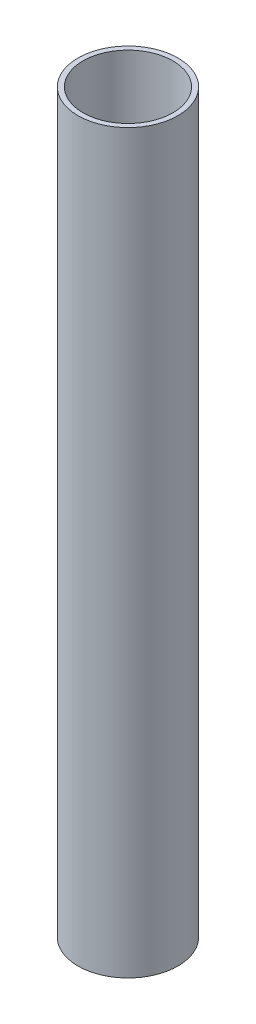
ISO-10303-21;
HEADER;
FILE_DESCRIPTION(('STEP AP214'),'2;1');
FILE_NAME('part.step','',(''),(''),'','','');
FILE_SCHEMA(('AUTOMOTIVE_DESIGN { 1 0 10303 214 1 1 1 1 }'));
ENDSEC;
DATA;
#1=APPLICATION_CONTEXT('core data for automotive mechanical design processes');
#2=APPLICATION_PROTOCOL_DEFINITION('international standard','automotive_design',2000,#1);
#3=PRODUCT_CONTEXT('',#1,'mechanical');
#4=PRODUCT('Part','Part','',(#3));
#5=PRODUCT_RELATED_PRODUCT_CATEGORY('part','',(#4));
#6=PRODUCT_DEFINITION_FORMATION('','',#4);
#7=PRODUCT_DEFINITION_CONTEXT('part definition',#1,'design');
#8=PRODUCT_DEFINITION('design','',#6,#7);
#9=PRODUCT_DEFINITION_SHAPE('','',#8);
#10=(LENGTH_UNIT() NAMED_UNIT(*) SI_UNIT(.MILLI.,.METRE.));
#11=(NAMED_UNIT(*) PLANE_ANGLE_UNIT() SI_UNIT($,.RADIAN.));
#12=(NAMED_UNIT(*) SI_UNIT($,.STERADIAN.) SOLID_ANGLE_UNIT());
#13=UNCERTAINTY_MEASURE_WITH_UNIT(LENGTH_MEASURE(1.E-05),#10,'distance_accuracy_value','');
#14=(GEOMETRIC_REPRESENTATION_CONTEXT(3) GLOBAL_UNCERTAINTY_ASSIGNED_CONTEXT((#13)) GLOBAL_UNIT_ASSIGNED_CONTEXT((#10,
#11,#12)) REPRESENTATION_CONTEXT('',''));
#15=CARTESIAN_POINT('',(0.,0.,0.));
#16=DIRECTION('',(0.,0.,1.));
#17=DIRECTION('',(1.,0.,0.));
#18=AXIS2_PLACEMENT_3D('',#15,#16,#17);
#19=CARTESIAN_POINT('',(0.,221.,0.));
#20=DIRECTION('',(0.,1.,0.));
#21=DIRECTION('',(0.,0.,1.));
#22=AXIS2_PLACEMENT_3D('',#19,#20,#21);
#23=PLANE('',#22);
#24=CARTESIAN_POINT('',(0.,221.,0.));
#25=DIRECTION('',(0.,1.,0.));
#26=DIRECTION('',(0.,0.,1.));
#27=AXIS2_PLACEMENT_3D('',#24,#25,#26);
#28=CIRCLE('',#27,15.);
#29=CARTESIAN_POINT('',(0.,221.,15.));
#30=VERTEX_POINT('',#29);
#31=EDGE_CURVE('E10',#30,#30,#28,.T.);
#32=ORIENTED_EDGE('',*,*,#31,.T.);
#33=EDGE_LOOP('',(#32));
#34=FACE_BOUND('',#33,.T.);
#35=CARTESIAN_POINT('',(0.,221.,0.));
#36=DIRECTION('',(0.,1.,0.));
#37=DIRECTION('',(0.,0.,1.));
#38=AXIS2_PLACEMENT_3D('',#35,#36,#37);
#39=CIRCLE('',#38,13.5);
#40=CARTESIAN_POINT('',(0.,221.,13.5));
#41=VERTEX_POINT('',#40);
#42=EDGE_CURVE('E43',#41,#41,#39,.T.);
#43=ORIENTED_EDGE('',*,*,#42,.F.);
#44=EDGE_LOOP('',(#43));
#45=FACE_BOUND('',#44,.T.);
#46=ADVANCED_FACE('F32',(#34,#45),#23,.T.);
#47=CARTESIAN_POINT('',(0.,0.,0.));
#48=DIRECTION('',(0.,1.,0.));
#49=DIRECTION('',(0.,0.,1.));
#50=AXIS2_PLACEMENT_3D('',#47,#48,#49);
#51=PLANE('',#50);
#52=CARTESIAN_POINT('',(0.,0.,0.));
#53=DIRECTION('',(0.,1.,0.));
#54=DIRECTION('',(0.,0.,1.));
#55=AXIS2_PLACEMENT_3D('',#52,#53,#54);
#56=CIRCLE('',#55,15.);
#57=CARTESIAN_POINT('',(0.,0.,15.));
#58=VERTEX_POINT('',#57);
#59=EDGE_CURVE('E36',#58,#58,#56,.T.);
#60=ORIENTED_EDGE('',*,*,#59,.F.);
#61=EDGE_LOOP('',(#60));
#62=FACE_BOUND('',#61,.T.);
#63=CARTESIAN_POINT('',(0.,0.,0.));
#64=DIRECTION('',(0.,1.,0.));
#65=DIRECTION('',(0.,0.,1.));
#66=AXIS2_PLACEMENT_3D('',#63,#64,#65);
#67=CIRCLE('',#66,13.5);
#68=CARTESIAN_POINT('',(0.,0.,13.5));
#69=VERTEX_POINT('',#68);
#70=EDGE_CURVE('E45',#69,#69,#67,.T.);
#71=ORIENTED_EDGE('',*,*,#70,.T.);
#72=EDGE_LOOP('',(#71));
#73=FACE_BOUND('',#72,.T.);
#74=ADVANCED_FACE('F55',(#62,#73),#51,.F.);
#75=CARTESIAN_POINT('',(0.,221.,0.));
#76=DIRECTION('',(0.,-1.,0.));
#77=DIRECTION('',(0.,0.,-1.));
#78=AXIS2_PLACEMENT_3D('',#75,#76,#77);
#79=CYLINDRICAL_SURFACE('',#78,15.);
#80=ORIENTED_EDGE('',*,*,#31,.F.);
#81=EDGE_LOOP('',(#80));
#82=FACE_BOUND('',#81,.T.);
#83=ORIENTED_EDGE('',*,*,#59,.T.);
#84=EDGE_LOOP('',(#83));
#85=FACE_BOUND('',#84,.T.);
#86=ADVANCED_FACE('F34',(#82,#85),#79,.T.);
#87=CARTESIAN_POINT('',(0.,221.,0.));
#88=DIRECTION('',(0.,-1.,0.));
#89=DIRECTION('',(0.,0.,-1.));
#90=AXIS2_PLACEMENT_3D('',#87,#88,#89);
#91=CYLINDRICAL_SURFACE('',#90,13.5);
#92=ORIENTED_EDGE('',*,*,#42,.T.);
#93=EDGE_LOOP('',(#92));
#94=FACE_BOUND('',#93,.T.);
#95=ORIENTED_EDGE('',*,*,#70,.F.);
#96=EDGE_LOOP('',(#95));
#97=FACE_BOUND('',#96,.T.);
#98=ADVANCED_FACE('F51',(#94,#97),#91,.F.);
#99=CLOSED_SHELL('',(#46,#74,#86,#98));
#100=MANIFOLD_SOLID_BREP('B2',#99);
#101=ADVANCED_BREP_SHAPE_REPRESENTATION('',(#18,#100),#14);
#102=SHAPE_DEFINITION_REPRESENTATION(#9,#101);
ENDSEC;
END-ISO-10303-21;
